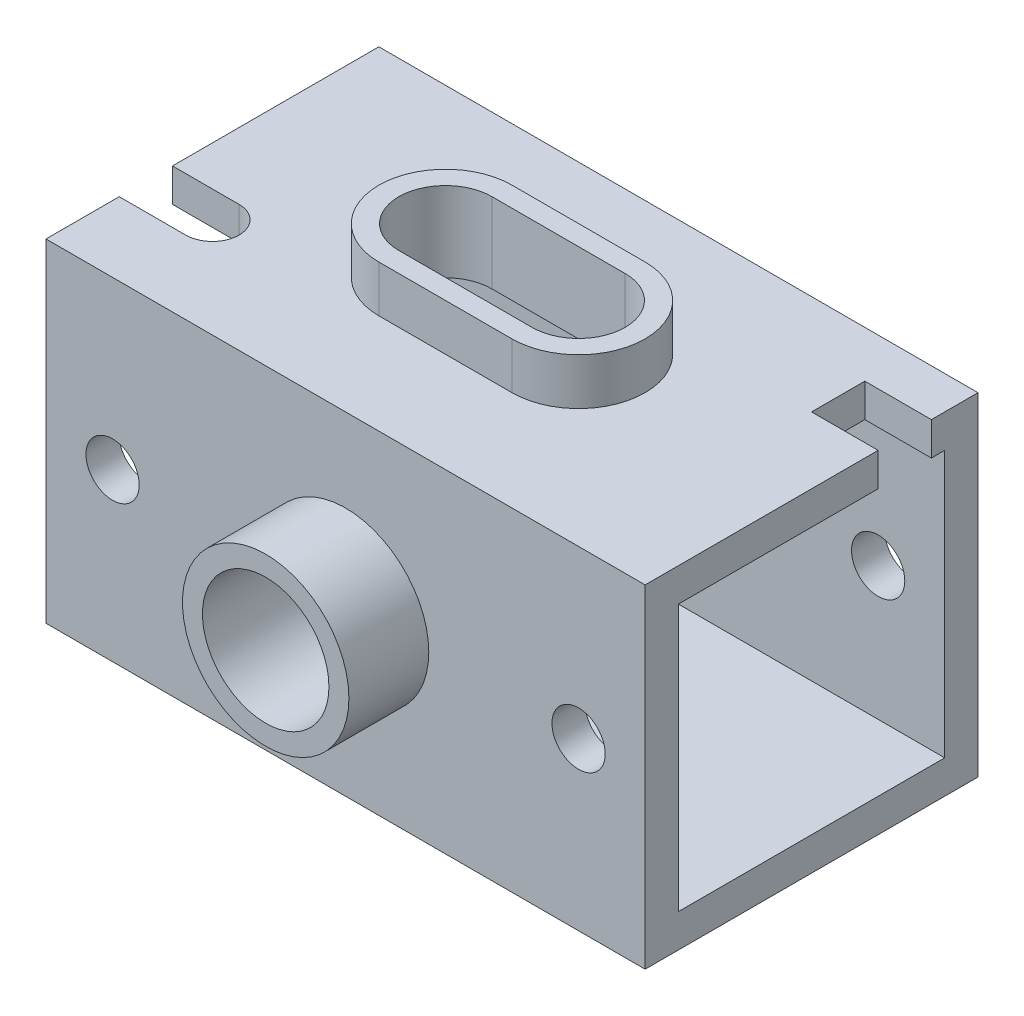
ISO-10303-21;
HEADER;
FILE_DESCRIPTION(('STEP AP214'),'2;1');
FILE_NAME('part.step','',(''),(''),'','','');
FILE_SCHEMA(('AUTOMOTIVE_DESIGN { 1 0 10303 214 1 1 1 1 }'));
ENDSEC;
DATA;
#1=APPLICATION_CONTEXT('core data for automotive mechanical design processes');
#2=APPLICATION_PROTOCOL_DEFINITION('international standard','automotive_design',2000,#1);
#3=PRODUCT_CONTEXT('',#1,'mechanical');
#4=PRODUCT('Part','Part','',(#3));
#5=PRODUCT_RELATED_PRODUCT_CATEGORY('part','',(#4));
#6=PRODUCT_DEFINITION_FORMATION('','',#4);
#7=PRODUCT_DEFINITION_CONTEXT('part definition',#1,'design');
#8=PRODUCT_DEFINITION('design','',#6,#7);
#9=PRODUCT_DEFINITION_SHAPE('','',#8);
#10=(LENGTH_UNIT() NAMED_UNIT(*) SI_UNIT(.MILLI.,.METRE.));
#11=(NAMED_UNIT(*) PLANE_ANGLE_UNIT() SI_UNIT($,.RADIAN.));
#12=(NAMED_UNIT(*) SI_UNIT($,.STERADIAN.) SOLID_ANGLE_UNIT());
#13=UNCERTAINTY_MEASURE_WITH_UNIT(LENGTH_MEASURE(1.E-05),#10,'distance_accuracy_value','');
#14=(GEOMETRIC_REPRESENTATION_CONTEXT(3) GLOBAL_UNCERTAINTY_ASSIGNED_CONTEXT((#13)) GLOBAL_UNIT_ASSIGNED_CONTEXT((#10,
#11,#12)) REPRESENTATION_CONTEXT('',''));
#15=CARTESIAN_POINT('',(0.,0.,0.));
#16=DIRECTION('',(0.,0.,1.));
#17=DIRECTION('',(1.,0.,0.));
#18=AXIS2_PLACEMENT_3D('',#15,#16,#17);
#19=CARTESIAN_POINT('',(0.,0.,-37.));
#20=DIRECTION('',(0.,0.,1.));
#21=DIRECTION('',(1.,0.,0.));
#22=AXIS2_PLACEMENT_3D('',#19,#20,#21);
#23=CYLINDRICAL_SURFACE('',#22,9.5);
#24=CARTESIAN_POINT('',(0.,0.,-37.));
#25=DIRECTION('',(0.,0.,1.));
#26=DIRECTION('',(1.,0.,0.));
#27=AXIS2_PLACEMENT_3D('',#24,#25,#26);
#28=CIRCLE('',#27,9.5);
#29=CARTESIAN_POINT('',(9.50000000000001,0.,-37.));
#30=VERTEX_POINT('',#29);
#31=EDGE_CURVE('E54',#30,#30,#28,.T.);
#32=ORIENTED_EDGE('',*,*,#31,.F.);
#33=EDGE_LOOP('',(#32));
#34=FACE_BOUND('',#33,.T.);
#35=CARTESIAN_POINT('',(0.,0.,-25.));
#36=DIRECTION('',(0.,0.,1.));
#37=DIRECTION('',(1.,0.,0.));
#38=AXIS2_PLACEMENT_3D('',#35,#36,#37);
#39=CIRCLE('',#38,9.5);
#40=CARTESIAN_POINT('',(9.50000000000001,0.,-25.));
#41=VERTEX_POINT('',#40);
#42=EDGE_CURVE('E62',#41,#41,#39,.T.);
#43=ORIENTED_EDGE('',*,*,#42,.T.);
#44=EDGE_LOOP('',(#43));
#45=FACE_BOUND('',#44,.T.);
#46=ADVANCED_FACE('F48',(#34,#45),#23,.F.);
#47=CARTESIAN_POINT('',(0.,0.,-37.));
#48=DIRECTION('',(0.,0.,1.));
#49=DIRECTION('',(1.,0.,0.));
#50=AXIS2_PLACEMENT_3D('',#47,#48,#49);
#51=CYLINDRICAL_SURFACE('',#50,12.5);
#52=CARTESIAN_POINT('',(0.,0.,-37.));
#53=DIRECTION('',(0.,0.,1.));
#54=DIRECTION('',(1.,0.,0.));
#55=AXIS2_PLACEMENT_3D('',#52,#53,#54);
#56=CIRCLE('',#55,12.5);
#57=CARTESIAN_POINT('',(12.5,0.,-37.));
#58=VERTEX_POINT('',#57);
#59=EDGE_CURVE('E11',#58,#58,#56,.T.);
#60=ORIENTED_EDGE('',*,*,#59,.T.);
#61=EDGE_LOOP('',(#60));
#62=FACE_BOUND('',#61,.T.);
#63=CARTESIAN_POINT('',(0.,0.,-25.));
#64=DIRECTION('',(0.,0.,1.));
#65=DIRECTION('',(1.,0.,0.));
#66=AXIS2_PLACEMENT_3D('',#63,#64,#65);
#67=CIRCLE('',#66,12.5);
#68=CARTESIAN_POINT('',(12.5,0.,-25.));
#69=VERTEX_POINT('',#68);
#70=EDGE_CURVE('E51',#69,#69,#67,.T.);
#71=ORIENTED_EDGE('',*,*,#70,.F.);
#72=EDGE_LOOP('',(#71));
#73=FACE_BOUND('',#72,.T.);
#74=ADVANCED_FACE('F68',(#62,#73),#51,.T.);
#75=CARTESIAN_POINT('',(0.,0.,-37.));
#76=DIRECTION('',(0.,0.,1.));
#77=DIRECTION('',(1.,0.,0.));
#78=AXIS2_PLACEMENT_3D('',#75,#76,#77);
#79=PLANE('',#78);
#80=ORIENTED_EDGE('',*,*,#31,.T.);
#81=EDGE_LOOP('',(#80));
#82=FACE_BOUND('',#81,.T.);
#83=ORIENTED_EDGE('',*,*,#59,.F.);
#84=EDGE_LOOP('',(#83));
#85=FACE_BOUND('',#84,.T.);
#86=ADVANCED_FACE('F75',(#82,#85),#79,.F.);
#87=CARTESIAN_POINT('',(0.,0.,-25.));
#88=DIRECTION('',(0.,0.,1.));
#89=DIRECTION('',(1.,0.,0.));
#90=AXIS2_PLACEMENT_3D('',#87,#88,#89);
#91=PLANE('',#90);
#92=ORIENTED_EDGE('',*,*,#42,.F.);
#93=EDGE_LOOP('',(#92));
#94=FACE_BOUND('',#93,.T.);
#95=ORIENTED_EDGE('',*,*,#70,.T.);
#96=EDGE_LOOP('',(#95));
#97=FACE_BOUND('',#96,.T.);
#98=ADVANCED_FACE('F70',(#94,#97),#91,.T.);
#99=CLOSED_SHELL('',(#46,#74,#86,#98));
#100=MANIFOLD_SOLID_BREP('B2',#99);
#101=CARTESIAN_POINT('',(0.,0.,20.));
#102=DIRECTION('',(0.,0.,1.));
#103=DIRECTION('',(1.,0.,0.));
#104=AXIS2_PLACEMENT_3D('',#101,#102,#103);
#105=CYLINDRICAL_SURFACE('',#104,9.5);
#106=CARTESIAN_POINT('',(0.,0.,20.));
#107=DIRECTION('',(0.,0.,1.));
#108=DIRECTION('',(1.,0.,0.));
#109=AXIS2_PLACEMENT_3D('',#106,#107,#108);
#110=CIRCLE('',#109,9.5);
#111=CARTESIAN_POINT('',(9.50000000000001,0.,20.));
#112=VERTEX_POINT('',#111);
#113=EDGE_CURVE('E123',#112,#112,#110,.T.);
#114=ORIENTED_EDGE('',*,*,#113,.F.);
#115=EDGE_LOOP('',(#114));
#116=FACE_BOUND('',#115,.T.);
#117=CARTESIAN_POINT('',(0.,0.,37.));
#118=DIRECTION('',(0.,0.,1.));
#119=DIRECTION('',(1.,0.,0.));
#120=AXIS2_PLACEMENT_3D('',#117,#118,#119);
#121=CIRCLE('',#120,9.5);
#122=CARTESIAN_POINT('',(9.50000000000001,0.,37.));
#123=VERTEX_POINT('',#122);
#124=EDGE_CURVE('E133',#123,#123,#121,.T.);
#125=ORIENTED_EDGE('',*,*,#124,.T.);
#126=EDGE_LOOP('',(#125));
#127=FACE_BOUND('',#126,.T.);
#128=ADVANCED_FACE('F119',(#116,#127),#105,.F.);
#129=CARTESIAN_POINT('',(0.,0.,20.));
#130=DIRECTION('',(0.,0.,1.));
#131=DIRECTION('',(1.,0.,0.));
#132=AXIS2_PLACEMENT_3D('',#129,#130,#131);
#133=CYLINDRICAL_SURFACE('',#132,12.5);
#134=CARTESIAN_POINT('',(0.,0.,20.));
#135=DIRECTION('',(0.,0.,1.));
#136=DIRECTION('',(1.,0.,0.));
#137=AXIS2_PLACEMENT_3D('',#134,#135,#136);
#138=CIRCLE('',#137,12.5);
#139=CARTESIAN_POINT('',(12.5,0.,20.));
#140=VERTEX_POINT('',#139);
#141=EDGE_CURVE('E50',#140,#140,#138,.T.);
#142=ORIENTED_EDGE('',*,*,#141,.T.);
#143=EDGE_LOOP('',(#142));
#144=FACE_BOUND('',#143,.T.);
#145=CARTESIAN_POINT('',(0.,0.,37.));
#146=DIRECTION('',(0.,0.,1.));
#147=DIRECTION('',(1.,0.,0.));
#148=AXIS2_PLACEMENT_3D('',#145,#146,#147);
#149=CIRCLE('',#148,12.5);
#150=CARTESIAN_POINT('',(12.5,0.,37.));
#151=VERTEX_POINT('',#150);
#152=EDGE_CURVE('E129',#151,#151,#149,.T.);
#153=ORIENTED_EDGE('',*,*,#152,.F.);
#154=EDGE_LOOP('',(#153));
#155=FACE_BOUND('',#154,.T.);
#156=ADVANCED_FACE('F150',(#144,#155),#133,.T.);
#157=CARTESIAN_POINT('',(0.,0.,20.));
#158=DIRECTION('',(0.,0.,1.));
#159=DIRECTION('',(1.,0.,0.));
#160=AXIS2_PLACEMENT_3D('',#157,#158,#159);
#161=PLANE('',#160);
#162=ORIENTED_EDGE('',*,*,#113,.T.);
#163=EDGE_LOOP('',(#162));
#164=FACE_BOUND('',#163,.T.);
#165=ORIENTED_EDGE('',*,*,#141,.F.);
#166=EDGE_LOOP('',(#165));
#167=FACE_BOUND('',#166,.T.);
#168=ADVANCED_FACE('F141',(#164,#167),#161,.F.);
#169=CARTESIAN_POINT('',(0.,0.,37.));
#170=DIRECTION('',(0.,0.,1.));
#171=DIRECTION('',(1.,0.,0.));
#172=AXIS2_PLACEMENT_3D('',#169,#170,#171);
#173=PLANE('',#172);
#174=ORIENTED_EDGE('',*,*,#124,.F.);
#175=EDGE_LOOP('',(#174));
#176=FACE_BOUND('',#175,.T.);
#177=ORIENTED_EDGE('',*,*,#152,.T.);
#178=EDGE_LOOP('',(#177));
#179=FACE_BOUND('',#178,.T.);
#180=ADVANCED_FACE('F138',(#176,#179),#173,.T.);
#181=CLOSED_SHELL('',(#128,#156,#168,#180));
#182=MANIFOLD_SOLID_BREP('B6',#181);
#183=CARTESIAN_POINT('',(45.,0.,25.));
#184=DIRECTION('',(-1.,0.,0.));
#185=DIRECTION('',(0.,0.,1.));
#186=AXIS2_PLACEMENT_3D('',#183,#184,#185);
#187=PLANE('',#186);
#188=DIRECTION('',(0.,1.,0.));
#189=VECTOR('',#188,1.);
#190=CARTESIAN_POINT('',(45.,-25.001,-18.));
#191=LINE('',#190,#189);
#192=CARTESIAN_POINT('',(45.,20.,-18.));
#193=VERTEX_POINT('',#192);
#194=CARTESIAN_POINT('',(45.,25.,-18.));
#195=VERTEX_POINT('',#194);
#196=EDGE_CURVE('E441',#193,#195,#191,.T.);
#197=ORIENTED_EDGE('',*,*,#196,.F.);
#198=DIRECTION('',(0.,0.,-1.));
#199=VECTOR('',#198,1.);
#200=CARTESIAN_POINT('',(45.,20.,25.));
#201=LINE('',#200,#199);
#202=CARTESIAN_POINT('',(45.,20.,-20.));
#203=VERTEX_POINT('',#202);
#204=EDGE_CURVE('E511',#193,#203,#201,.T.);
#205=ORIENTED_EDGE('',*,*,#204,.T.);
#206=DIRECTION('',(0.,1.,0.));
#207=VECTOR('',#206,1.);
#208=CARTESIAN_POINT('',(45.,0.,-20.));
#209=LINE('',#208,#207);
#210=CARTESIAN_POINT('',(45.,-20.,-20.));
#211=VERTEX_POINT('',#210);
#212=EDGE_CURVE('E411',#211,#203,#209,.T.);
#213=ORIENTED_EDGE('',*,*,#212,.F.);
#214=DIRECTION('',(0.,0.,-1.));
#215=VECTOR('',#214,1.);
#216=CARTESIAN_POINT('',(45.,-20.,25.));
#217=LINE('',#216,#215);
#218=CARTESIAN_POINT('',(45.,-20.,20.));
#219=VERTEX_POINT('',#218);
#220=EDGE_CURVE('E549',#219,#211,#217,.T.);
#221=ORIENTED_EDGE('',*,*,#220,.F.);
#222=DIRECTION('',(0.,1.,0.));
#223=VECTOR('',#222,1.);
#224=CARTESIAN_POINT('',(45.,0.,20.));
#225=LINE('',#224,#223);
#226=CARTESIAN_POINT('',(45.,20.,20.));
#227=VERTEX_POINT('',#226);
#228=EDGE_CURVE('E484',#219,#227,#225,.T.);
#229=ORIENTED_EDGE('',*,*,#228,.T.);
#230=CARTESIAN_POINT('',(45.,20.,-10.));
#231=VERTEX_POINT('',#230);
#232=EDGE_CURVE('E514',#227,#231,#201,.T.);
#233=ORIENTED_EDGE('',*,*,#232,.T.);
#234=DIRECTION('',(0.,1.,0.));
#235=VECTOR('',#234,1.);
#236=CARTESIAN_POINT('',(45.,-25.001,-10.));
#237=LINE('',#236,#235);
#238=CARTESIAN_POINT('',(45.,25.,-10.));
#239=VERTEX_POINT('',#238);
#240=EDGE_CURVE('E434',#231,#239,#237,.T.);
#241=ORIENTED_EDGE('',*,*,#240,.T.);
#242=DIRECTION('',(0.,0.,-1.));
#243=VECTOR('',#242,1.);
#244=CARTESIAN_POINT('',(45.,25.,25.));
#245=LINE('',#244,#243);
#246=CARTESIAN_POINT('',(45.,25.,25.));
#247=VERTEX_POINT('',#246);
#248=EDGE_CURVE('E508',#247,#239,#245,.T.);
#249=ORIENTED_EDGE('',*,*,#248,.F.);
#250=DIRECTION('',(0.,1.,0.));
#251=VECTOR('',#250,1.);
#252=CARTESIAN_POINT('',(45.,0.,25.));
#253=LINE('',#252,#251);
#254=CARTESIAN_POINT('',(45.,-25.,25.));
#255=VERTEX_POINT('',#254);
#256=EDGE_CURVE('E547',#255,#247,#253,.T.);
#257=ORIENTED_EDGE('',*,*,#256,.F.);
#258=DIRECTION('',(0.,0.,-1.));
#259=VECTOR('',#258,1.);
#260=CARTESIAN_POINT('',(45.,-25.,25.));
#261=LINE('',#260,#259);
#262=CARTESIAN_POINT('',(45.,-25.,-25.));
#263=VERTEX_POINT('',#262);
#264=EDGE_CURVE('E559',#255,#263,#261,.T.);
#265=ORIENTED_EDGE('',*,*,#264,.T.);
#266=DIRECTION('',(0.,1.,0.));
#267=VECTOR('',#266,1.);
#268=CARTESIAN_POINT('',(45.,0.,-25.));
#269=LINE('',#268,#267);
#270=CARTESIAN_POINT('',(45.,25.,-25.));
#271=VERTEX_POINT('',#270);
#272=EDGE_CURVE('E546',#263,#271,#269,.T.);
#273=ORIENTED_EDGE('',*,*,#272,.T.);
#274=EDGE_CURVE('E506',#195,#271,#245,.T.);
#275=ORIENTED_EDGE('',*,*,#274,.F.);
#276=EDGE_LOOP('',(#197,#205,#213,#221,#229,#233,#241,#249,#257,#265,#273,#275));
#277=FACE_BOUND('',#276,.T.);
#278=ADVANCED_FACE('F182',(#277),#187,.F.);
#279=CARTESIAN_POINT('',(0.,20.,25.));
#280=DIRECTION('',(0.,1.,0.));
#281=DIRECTION('',(0.,0.,1.));
#282=AXIS2_PLACEMENT_3D('',#279,#280,#281);
#283=PLANE('',#282);
#284=DIRECTION('',(-1.,0.,0.));
#285=VECTOR('',#284,1.);
#286=CARTESIAN_POINT('',(0.,20.,-7.));
#287=LINE('',#286,#285);
#288=CARTESIAN_POINT('',(10.,20.,-7.));
#289=VERTEX_POINT('',#288);
#290=CARTESIAN_POINT('',(-10.,20.,-7.));
#291=VERTEX_POINT('',#290);
#292=EDGE_CURVE('E353',#289,#291,#287,.T.);
#293=ORIENTED_EDGE('',*,*,#292,.T.);
#294=CARTESIAN_POINT('',(-10.,20.,0.));
#295=DIRECTION('',(0.,1.,0.));
#296=DIRECTION('',(0.,0.,1.));
#297=AXIS2_PLACEMENT_3D('',#294,#295,#296);
#298=CIRCLE('',#297,7.);
#299=CARTESIAN_POINT('',(-10.,20.,7.));
#300=VERTEX_POINT('',#299);
#301=EDGE_CURVE('E346',#300,#291,#298,.F.);
#302=ORIENTED_EDGE('',*,*,#301,.F.);
#303=DIRECTION('',(-1.,0.,0.));
#304=VECTOR('',#303,1.);
#305=CARTESIAN_POINT('',(0.,20.,7.));
#306=LINE('',#305,#304);
#307=CARTESIAN_POINT('',(10.,20.,7.));
#308=VERTEX_POINT('',#307);
#309=EDGE_CURVE('E455',#308,#300,#306,.T.);
#310=ORIENTED_EDGE('',*,*,#309,.F.);
#311=CARTESIAN_POINT('',(10.,20.,0.));
#312=DIRECTION('',(0.,1.,0.));
#313=DIRECTION('',(0.,0.,1.));
#314=AXIS2_PLACEMENT_3D('',#311,#312,#313);
#315=CIRCLE('',#314,7.);
#316=EDGE_CURVE('E453',#289,#308,#315,.F.);
#317=ORIENTED_EDGE('',*,*,#316,.F.);
#318=EDGE_LOOP('',(#293,#302,#310,#317));
#319=FACE_BOUND('',#318,.T.);
#320=DIRECTION('',(-1.,0.,0.));
#321=VECTOR('',#320,1.);
#322=CARTESIAN_POINT('',(0.,20.,14.));
#323=LINE('',#322,#321);
#324=CARTESIAN_POINT('',(-35.,20.,14.));
#325=VERTEX_POINT('',#324);
#326=CARTESIAN_POINT('',(-45.,20.,14.));
#327=VERTEX_POINT('',#326);
#328=EDGE_CURVE('E405',#325,#327,#323,.T.);
#329=ORIENTED_EDGE('',*,*,#328,.F.);
#330=CARTESIAN_POINT('',(-35.,20.,10.));
#331=DIRECTION('',(0.,1.,0.));
#332=DIRECTION('',(0.,0.,1.));
#333=AXIS2_PLACEMENT_3D('',#330,#331,#332);
#334=CIRCLE('',#333,4.);
#335=CARTESIAN_POINT('',(-35.,20.,6.));
#336=VERTEX_POINT('',#335);
#337=EDGE_CURVE('E396',#336,#325,#334,.F.);
#338=ORIENTED_EDGE('',*,*,#337,.F.);
#339=DIRECTION('',(-1.,0.,0.));
#340=VECTOR('',#339,1.);
#341=CARTESIAN_POINT('',(0.,20.,6.));
#342=LINE('',#341,#340);
#343=CARTESIAN_POINT('',(-45.,20.,6.));
#344=VERTEX_POINT('',#343);
#345=EDGE_CURVE('E413',#336,#344,#342,.T.);
#346=ORIENTED_EDGE('',*,*,#345,.T.);
#347=DIRECTION('',(0.,0.,-1.));
#348=VECTOR('',#347,1.);
#349=CARTESIAN_POINT('',(-45.,20.,25.));
#350=LINE('',#349,#348);
#351=CARTESIAN_POINT('',(-45.,20.,-20.));
#352=VERTEX_POINT('',#351);
#353=EDGE_CURVE('E496',#344,#352,#350,.T.);
#354=ORIENTED_EDGE('',*,*,#353,.T.);
#355=DIRECTION('',(1.,0.,0.));
#356=VECTOR('',#355,1.);
#357=CARTESIAN_POINT('',(0.,20.,-20.));
#358=LINE('',#357,#356);
#359=EDGE_CURVE('E477',#352,#203,#358,.T.);
#360=ORIENTED_EDGE('',*,*,#359,.T.);
#361=ORIENTED_EDGE('',*,*,#204,.F.);
#362=DIRECTION('',(1.,0.,0.));
#363=VECTOR('',#362,1.);
#364=CARTESIAN_POINT('',(0.,20.,-18.));
#365=LINE('',#364,#363);
#366=CARTESIAN_POINT('',(35.,20.,-18.));
#367=VERTEX_POINT('',#366);
#368=EDGE_CURVE('E426',#367,#193,#365,.T.);
#369=ORIENTED_EDGE('',*,*,#368,.F.);
#370=DIRECTION('',(0.,0.,-1.));
#371=VECTOR('',#370,1.);
#372=CARTESIAN_POINT('',(35.,20.,0.));
#373=LINE('',#372,#371);
#374=CARTESIAN_POINT('',(35.,20.,-9.99999999999999));
#375=VERTEX_POINT('',#374);
#376=EDGE_CURVE('E430',#375,#367,#373,.T.);
#377=ORIENTED_EDGE('',*,*,#376,.F.);
#378=DIRECTION('',(1.,0.,0.));
#379=VECTOR('',#378,1.);
#380=CARTESIAN_POINT('',(0.,20.,-9.99999999999998));
#381=LINE('',#380,#379);
#382=EDGE_CURVE('E442',#375,#231,#381,.T.);
#383=ORIENTED_EDGE('',*,*,#382,.T.);
#384=ORIENTED_EDGE('',*,*,#232,.F.);
#385=DIRECTION('',(1.,0.,0.));
#386=VECTOR('',#385,1.);
#387=CARTESIAN_POINT('',(0.,20.,20.));
#388=LINE('',#387,#386);
#389=CARTESIAN_POINT('',(-45.,20.,20.));
#390=VERTEX_POINT('',#389);
#391=EDGE_CURVE('E533',#390,#227,#388,.T.);
#392=ORIENTED_EDGE('',*,*,#391,.F.);
#393=EDGE_CURVE('E505',#390,#327,#350,.T.);
#394=ORIENTED_EDGE('',*,*,#393,.T.);
#395=EDGE_LOOP('',(#329,#338,#346,#354,#360,#361,#369,#377,#383,#384,#392,#394));
#396=FACE_BOUND('',#395,.T.);
#397=ADVANCED_FACE('F605',(#319,#396),#283,.F.);
#398=CARTESIAN_POINT('',(0.,25.,25.));
#399=DIRECTION('',(0.,1.,0.));
#400=DIRECTION('',(0.,0.,1.));
#401=AXIS2_PLACEMENT_3D('',#398,#399,#400);
#402=PLANE('',#401);
#403=DIRECTION('',(1.,0.,0.));
#404=VECTOR('',#403,1.);
#405=CARTESIAN_POINT('',(0.,25.,10.));
#406=LINE('',#405,#404);
#407=CARTESIAN_POINT('',(-10.,25.,10.));
#408=VERTEX_POINT('',#407);
#409=CARTESIAN_POINT('',(10.,25.,10.));
#410=VERTEX_POINT('',#409);
#411=EDGE_CURVE('E198',#408,#410,#406,.T.);
#412=ORIENTED_EDGE('',*,*,#411,.F.);
#413=CARTESIAN_POINT('',(-10.,25.,0.));
#414=DIRECTION('',(0.,1.,0.));
#415=DIRECTION('',(0.,0.,1.));
#416=AXIS2_PLACEMENT_3D('',#413,#414,#415);
#417=CIRCLE('',#416,10.);
#418=CARTESIAN_POINT('',(-10.,25.,-10.));
#419=VERTEX_POINT('',#418);
#420=EDGE_CURVE('E199',#419,#408,#417,.T.);
#421=ORIENTED_EDGE('',*,*,#420,.F.);
#422=DIRECTION('',(1.,0.,0.));
#423=VECTOR('',#422,1.);
#424=CARTESIAN_POINT('',(0.,25.,-10.));
#425=LINE('',#424,#423);
#426=CARTESIAN_POINT('',(10.,25.,-10.));
#427=VERTEX_POINT('',#426);
#428=EDGE_CURVE('E366',#419,#427,#425,.T.);
#429=ORIENTED_EDGE('',*,*,#428,.T.);
#430=CARTESIAN_POINT('',(10.,25.,0.));
#431=DIRECTION('',(0.,1.,0.));
#432=DIRECTION('',(0.,0.,1.));
#433=AXIS2_PLACEMENT_3D('',#430,#431,#432);
#434=CIRCLE('',#433,10.);
#435=EDGE_CURVE('E384',#410,#427,#434,.T.);
#436=ORIENTED_EDGE('',*,*,#435,.F.);
#437=EDGE_LOOP('',(#412,#421,#429,#436));
#438=FACE_BOUND('',#437,.T.);
#439=DIRECTION('',(1.,0.,0.));
#440=VECTOR('',#439,1.);
#441=CARTESIAN_POINT('',(0.,25.,14.));
#442=LINE('',#441,#440);
#443=CARTESIAN_POINT('',(-45.,25.,14.));
#444=VERTEX_POINT('',#443);
#445=CARTESIAN_POINT('',(-35.,25.,14.));
#446=VERTEX_POINT('',#445);
#447=EDGE_CURVE('E412',#444,#446,#442,.T.);
#448=ORIENTED_EDGE('',*,*,#447,.F.);
#449=DIRECTION('',(0.,0.,-1.));
#450=VECTOR('',#449,1.);
#451=CARTESIAN_POINT('',(-45.,25.,25.));
#452=LINE('',#451,#450);
#453=CARTESIAN_POINT('',(-45.,25.,25.));
#454=VERTEX_POINT('',#453);
#455=EDGE_CURVE('E507',#454,#444,#452,.T.);
#456=ORIENTED_EDGE('',*,*,#455,.F.);
#457=DIRECTION('',(1.,0.,0.));
#458=VECTOR('',#457,1.);
#459=CARTESIAN_POINT('',(0.,25.,25.));
#460=LINE('',#459,#458);
#461=EDGE_CURVE('E497',#454,#247,#460,.T.);
#462=ORIENTED_EDGE('',*,*,#461,.T.);
#463=ORIENTED_EDGE('',*,*,#248,.T.);
#464=DIRECTION('',(-1.,0.,0.));
#465=VECTOR('',#464,1.);
#466=CARTESIAN_POINT('',(0.,25.,-9.99999999999998));
#467=LINE('',#466,#465);
#468=CARTESIAN_POINT('',(35.,25.,-9.99999999999999));
#469=VERTEX_POINT('',#468);
#470=EDGE_CURVE('E431',#239,#469,#467,.T.);
#471=ORIENTED_EDGE('',*,*,#470,.T.);
#472=DIRECTION('',(0.,0.,1.));
#473=VECTOR('',#472,1.);
#474=CARTESIAN_POINT('',(35.,25.,0.));
#475=LINE('',#474,#473);
#476=CARTESIAN_POINT('',(35.,25.,-18.));
#477=VERTEX_POINT('',#476);
#478=EDGE_CURVE('E429',#477,#469,#475,.T.);
#479=ORIENTED_EDGE('',*,*,#478,.F.);
#480=DIRECTION('',(-1.,0.,0.));
#481=VECTOR('',#480,1.);
#482=CARTESIAN_POINT('',(0.,25.,-18.));
#483=LINE('',#482,#481);
#484=EDGE_CURVE('E437',#195,#477,#483,.T.);
#485=ORIENTED_EDGE('',*,*,#484,.F.);
#486=ORIENTED_EDGE('',*,*,#274,.T.);
#487=DIRECTION('',(1.,0.,0.));
#488=VECTOR('',#487,1.);
#489=CARTESIAN_POINT('',(0.,25.,-25.));
#490=LINE('',#489,#488);
#491=CARTESIAN_POINT('',(-45.,25.,-25.));
#492=VERTEX_POINT('',#491);
#493=EDGE_CURVE('E494',#492,#271,#490,.T.);
#494=ORIENTED_EDGE('',*,*,#493,.F.);
#495=CARTESIAN_POINT('',(-45.,25.,6.));
#496=VERTEX_POINT('',#495);
#497=EDGE_CURVE('E501',#496,#492,#452,.T.);
#498=ORIENTED_EDGE('',*,*,#497,.F.);
#499=DIRECTION('',(1.,0.,0.));
#500=VECTOR('',#499,1.);
#501=CARTESIAN_POINT('',(0.,25.,6.));
#502=LINE('',#501,#500);
#503=CARTESIAN_POINT('',(-35.,25.,6.));
#504=VERTEX_POINT('',#503);
#505=EDGE_CURVE('E404',#496,#504,#502,.T.);
#506=ORIENTED_EDGE('',*,*,#505,.T.);
#507=CARTESIAN_POINT('',(-35.,25.,10.));
#508=DIRECTION('',(0.,1.,0.));
#509=DIRECTION('',(0.,0.,1.));
#510=AXIS2_PLACEMENT_3D('',#507,#508,#509);
#511=CIRCLE('',#510,4.);
#512=EDGE_CURVE('E401',#446,#504,#511,.T.);
#513=ORIENTED_EDGE('',*,*,#512,.F.);
#514=EDGE_LOOP('',(#448,#456,#462,#463,#471,#479,#485,#486,#494,#498,#506,#513));
#515=FACE_BOUND('',#514,.T.);
#516=ADVANCED_FACE('F578',(#438,#515),#402,.T.);
#517=CARTESIAN_POINT('',(0.,-20.,25.));
#518=DIRECTION('',(0.,1.,0.));
#519=DIRECTION('',(0.,0.,1.));
#520=AXIS2_PLACEMENT_3D('',#517,#518,#519);
#521=PLANE('',#520);
#522=DIRECTION('',(1.,0.,0.));
#523=VECTOR('',#522,1.);
#524=CARTESIAN_POINT('',(0.,-20.,-20.));
#525=LINE('',#524,#523);
#526=CARTESIAN_POINT('',(-45.,-20.,-20.));
#527=VERTEX_POINT('',#526);
#528=EDGE_CURVE('E483',#527,#211,#525,.T.);
#529=ORIENTED_EDGE('',*,*,#528,.F.);
#530=DIRECTION('',(0.,0.,-1.));
#531=VECTOR('',#530,1.);
#532=CARTESIAN_POINT('',(-45.,-20.,25.));
#533=LINE('',#532,#531);
#534=CARTESIAN_POINT('',(-45.,-20.,20.));
#535=VERTEX_POINT('',#534);
#536=EDGE_CURVE('E120',#535,#527,#533,.T.);
#537=ORIENTED_EDGE('',*,*,#536,.F.);
#538=DIRECTION('',(1.,0.,0.));
#539=VECTOR('',#538,1.);
#540=CARTESIAN_POINT('',(0.,-20.,20.));
#541=LINE('',#540,#539);
#542=EDGE_CURVE('E531',#535,#219,#541,.T.);
#543=ORIENTED_EDGE('',*,*,#542,.T.);
#544=ORIENTED_EDGE('',*,*,#220,.T.);
#545=EDGE_LOOP('',(#529,#537,#543,#544));
#546=FACE_BOUND('',#545,.T.);
#547=ADVANCED_FACE('F181',(#546),#521,.T.);
#548=CARTESIAN_POINT('',(-45.,0.,25.));
#549=DIRECTION('',(-1.,0.,0.));
#550=DIRECTION('',(0.,0.,1.));
#551=AXIS2_PLACEMENT_3D('',#548,#549,#550);
#552=PLANE('',#551);
#553=DIRECTION('',(0.,1.,0.));
#554=VECTOR('',#553,1.);
#555=CARTESIAN_POINT('',(-45.,-25.001,14.));
#556=LINE('',#555,#554);
#557=EDGE_CURVE('E416',#327,#444,#556,.T.);
#558=ORIENTED_EDGE('',*,*,#557,.F.);
#559=ORIENTED_EDGE('',*,*,#393,.F.);
#560=DIRECTION('',(0.,1.,0.));
#561=VECTOR('',#560,1.);
#562=CARTESIAN_POINT('',(-45.,0.,20.));
#563=LINE('',#562,#561);
#564=EDGE_CURVE('E520',#535,#390,#563,.T.);
#565=ORIENTED_EDGE('',*,*,#564,.F.);
#566=ORIENTED_EDGE('',*,*,#536,.T.);
#567=DIRECTION('',(0.,1.,0.));
#568=VECTOR('',#567,1.);
#569=CARTESIAN_POINT('',(-45.,0.,-20.));
#570=LINE('',#569,#568);
#571=EDGE_CURVE('E464',#527,#352,#570,.T.);
#572=ORIENTED_EDGE('',*,*,#571,.T.);
#573=ORIENTED_EDGE('',*,*,#353,.F.);
#574=DIRECTION('',(0.,1.,0.));
#575=VECTOR('',#574,1.);
#576=CARTESIAN_POINT('',(-45.,-25.001,6.));
#577=LINE('',#576,#575);
#578=EDGE_CURVE('E408',#344,#496,#577,.T.);
#579=ORIENTED_EDGE('',*,*,#578,.T.);
#580=ORIENTED_EDGE('',*,*,#497,.T.);
#581=DIRECTION('',(0.,1.,0.));
#582=VECTOR('',#581,1.);
#583=CARTESIAN_POINT('',(-45.,0.,-25.));
#584=LINE('',#583,#582);
#585=CARTESIAN_POINT('',(-45.,-25.,-25.));
#586=VERTEX_POINT('',#585);
#587=EDGE_CURVE('E532',#586,#492,#584,.T.);
#588=ORIENTED_EDGE('',*,*,#587,.F.);
#589=DIRECTION('',(0.,0.,-1.));
#590=VECTOR('',#589,1.);
#591=CARTESIAN_POINT('',(-45.,-25.,25.));
#592=LINE('',#591,#590);
#593=CARTESIAN_POINT('',(-45.,-25.,25.));
#594=VERTEX_POINT('',#593);
#595=EDGE_CURVE('E189',#594,#586,#592,.T.);
#596=ORIENTED_EDGE('',*,*,#595,.F.);
#597=DIRECTION('',(0.,1.,0.));
#598=VECTOR('',#597,1.);
#599=CARTESIAN_POINT('',(-45.,0.,25.));
#600=LINE('',#599,#598);
#601=EDGE_CURVE('E543',#594,#454,#600,.T.);
#602=ORIENTED_EDGE('',*,*,#601,.T.);
#603=ORIENTED_EDGE('',*,*,#455,.T.);
#604=EDGE_LOOP('',(#558,#559,#565,#566,#572,#573,#579,#580,#588,#596,#602,#603));
#605=FACE_BOUND('',#604,.T.);
#606=ADVANCED_FACE('F571',(#605),#552,.T.);
#607=CARTESIAN_POINT('',(0.,-25.,25.));
#608=DIRECTION('',(0.,1.,0.));
#609=DIRECTION('',(0.,0.,1.));
#610=AXIS2_PLACEMENT_3D('',#607,#608,#609);
#611=PLANE('',#610);
#612=DIRECTION('',(1.,0.,0.));
#613=VECTOR('',#612,1.);
#614=CARTESIAN_POINT('',(0.,-25.,-25.));
#615=LINE('',#614,#613);
#616=EDGE_CURVE('E554',#586,#263,#615,.T.);
#617=ORIENTED_EDGE('',*,*,#616,.T.);
#618=ORIENTED_EDGE('',*,*,#264,.F.);
#619=DIRECTION('',(1.,0.,0.));
#620=VECTOR('',#619,1.);
#621=CARTESIAN_POINT('',(0.,-25.,25.));
#622=LINE('',#621,#620);
#623=EDGE_CURVE('E544',#594,#255,#622,.T.);
#624=ORIENTED_EDGE('',*,*,#623,.F.);
#625=ORIENTED_EDGE('',*,*,#595,.T.);
#626=EDGE_LOOP('',(#617,#618,#624,#625));
#627=FACE_BOUND('',#626,.T.);
#628=ADVANCED_FACE('F561',(#627),#611,.F.);
#629=CARTESIAN_POINT('',(0.,0.,25.));
#630=DIRECTION('',(0.,0.,1.));
#631=DIRECTION('',(1.,0.,0.));
#632=AXIS2_PLACEMENT_3D('',#629,#630,#631);
#633=PLANE('',#632);
#634=ORIENTED_EDGE('',*,*,#256,.T.);
#635=ORIENTED_EDGE('',*,*,#461,.F.);
#636=ORIENTED_EDGE('',*,*,#601,.F.);
#637=ORIENTED_EDGE('',*,*,#623,.T.);
#638=EDGE_LOOP('',(#634,#635,#636,#637));
#639=FACE_BOUND('',#638,.T.);
#640=CARTESIAN_POINT('',(-35.,0.,25.));
#641=DIRECTION('',(0.,0.,1.));
#642=DIRECTION('',(1.,0.,0.));
#643=AXIS2_PLACEMENT_3D('',#640,#641,#642);
#644=CIRCLE('',#643,4.);
#645=CARTESIAN_POINT('',(-31.,0.,25.));
#646=VERTEX_POINT('',#645);
#647=EDGE_CURVE('E516',#646,#646,#644,.T.);
#648=ORIENTED_EDGE('',*,*,#647,.F.);
#649=EDGE_LOOP('',(#648));
#650=FACE_BOUND('',#649,.T.);
#651=CARTESIAN_POINT('',(0.,0.,25.));
#652=DIRECTION('',(0.,0.,1.));
#653=DIRECTION('',(1.,0.,0.));
#654=AXIS2_PLACEMENT_3D('',#651,#652,#653);
#655=CIRCLE('',#654,12.5);
#656=CARTESIAN_POINT('',(12.5,0.,25.));
#657=VERTEX_POINT('',#656);
#658=EDGE_CURVE('E538',#657,#657,#655,.T.);
#659=ORIENTED_EDGE('',*,*,#658,.F.);
#660=EDGE_LOOP('',(#659));
#661=FACE_BOUND('',#660,.T.);
#662=CARTESIAN_POINT('',(35.,0.,25.));
#663=DIRECTION('',(0.,0.,1.));
#664=DIRECTION('',(1.,0.,0.));
#665=AXIS2_PLACEMENT_3D('',#662,#663,#664);
#666=CIRCLE('',#665,4.00000000000001);
#667=CARTESIAN_POINT('',(39.,0.,25.));
#668=VERTEX_POINT('',#667);
#669=EDGE_CURVE('E523',#668,#668,#666,.T.);
#670=ORIENTED_EDGE('',*,*,#669,.F.);
#671=EDGE_LOOP('',(#670));
#672=FACE_BOUND('',#671,.T.);
#673=ADVANCED_FACE('F591',(#639,#650,#661,#672),#633,.T.);
#674=CARTESIAN_POINT('',(0.,0.,-25.));
#675=DIRECTION('',(0.,0.,1.));
#676=DIRECTION('',(1.,0.,0.));
#677=AXIS2_PLACEMENT_3D('',#674,#675,#676);
#678=PLANE('',#677);
#679=ORIENTED_EDGE('',*,*,#493,.T.);
#680=ORIENTED_EDGE('',*,*,#272,.F.);
#681=ORIENTED_EDGE('',*,*,#616,.F.);
#682=ORIENTED_EDGE('',*,*,#587,.T.);
#683=EDGE_LOOP('',(#679,#680,#681,#682));
#684=FACE_BOUND('',#683,.T.);
#685=CARTESIAN_POINT('',(-35.,0.,-25.));
#686=DIRECTION('',(0.,0.,1.));
#687=DIRECTION('',(1.,0.,0.));
#688=AXIS2_PLACEMENT_3D('',#685,#686,#687);
#689=CIRCLE('',#688,4.);
#690=CARTESIAN_POINT('',(-31.,0.,-25.));
#691=VERTEX_POINT('',#690);
#692=EDGE_CURVE('E469',#691,#691,#689,.T.);
#693=ORIENTED_EDGE('',*,*,#692,.T.);
#694=EDGE_LOOP('',(#693));
#695=FACE_BOUND('',#694,.T.);
#696=CARTESIAN_POINT('',(0.,0.,-25.));
#697=DIRECTION('',(0.,0.,1.));
#698=DIRECTION('',(1.,0.,0.));
#699=AXIS2_PLACEMENT_3D('',#696,#697,#698);
#700=CIRCLE('',#699,12.5);
#701=CARTESIAN_POINT('',(12.5,0.,-25.));
#702=VERTEX_POINT('',#701);
#703=EDGE_CURVE('E488',#702,#702,#700,.T.);
#704=ORIENTED_EDGE('',*,*,#703,.T.);
#705=EDGE_LOOP('',(#704));
#706=FACE_BOUND('',#705,.T.);
#707=CARTESIAN_POINT('',(35.,0.,-25.));
#708=DIRECTION('',(0.,0.,1.));
#709=DIRECTION('',(1.,0.,0.));
#710=AXIS2_PLACEMENT_3D('',#707,#708,#709);
#711=CIRCLE('',#710,4.00000000000001);
#712=CARTESIAN_POINT('',(39.,0.,-25.));
#713=VERTEX_POINT('',#712);
#714=EDGE_CURVE('E475',#713,#713,#711,.T.);
#715=ORIENTED_EDGE('',*,*,#714,.T.);
#716=EDGE_LOOP('',(#715));
#717=FACE_BOUND('',#716,.T.);
#718=ADVANCED_FACE('F572',(#684,#695,#706,#717),#678,.F.);
#719=CARTESIAN_POINT('',(35.,0.,20.));
#720=DIRECTION('',(0.,0.,1.));
#721=DIRECTION('',(1.,0.,0.));
#722=AXIS2_PLACEMENT_3D('',#719,#720,#721);
#723=CYLINDRICAL_SURFACE('',#722,4.00000000000001);
#724=CARTESIAN_POINT('',(35.,0.,20.));
#725=DIRECTION('',(0.,0.,1.));
#726=DIRECTION('',(1.,0.,0.));
#727=AXIS2_PLACEMENT_3D('',#724,#725,#726);
#728=CIRCLE('',#727,4.00000000000001);
#729=CARTESIAN_POINT('',(39.,0.,20.));
#730=VERTEX_POINT('',#729);
#731=EDGE_CURVE('E526',#730,#730,#728,.T.);
#732=ORIENTED_EDGE('',*,*,#731,.F.);
#733=EDGE_LOOP('',(#732));
#734=FACE_BOUND('',#733,.T.);
#735=ORIENTED_EDGE('',*,*,#669,.T.);
#736=EDGE_LOOP('',(#735));
#737=FACE_BOUND('',#736,.T.);
#738=ADVANCED_FACE('F663',(#734,#737),#723,.F.);
#739=CARTESIAN_POINT('',(0.,0.,20.));
#740=DIRECTION('',(0.,0.,1.));
#741=DIRECTION('',(1.,0.,0.));
#742=AXIS2_PLACEMENT_3D('',#739,#740,#741);
#743=CYLINDRICAL_SURFACE('',#742,12.5);
#744=CARTESIAN_POINT('',(0.,0.,20.));
#745=DIRECTION('',(0.,0.,1.));
#746=DIRECTION('',(1.,0.,0.));
#747=AXIS2_PLACEMENT_3D('',#744,#745,#746);
#748=CIRCLE('',#747,12.5);
#749=CARTESIAN_POINT('',(12.5,0.,20.));
#750=VERTEX_POINT('',#749);
#751=EDGE_CURVE('E521',#750,#750,#748,.T.);
#752=ORIENTED_EDGE('',*,*,#751,.F.);
#753=EDGE_LOOP('',(#752));
#754=FACE_BOUND('',#753,.T.);
#755=ORIENTED_EDGE('',*,*,#658,.T.);
#756=EDGE_LOOP('',(#755));
#757=FACE_BOUND('',#756,.T.);
#758=ADVANCED_FACE('F668',(#754,#757),#743,.F.);
#759=CARTESIAN_POINT('',(-35.,0.,20.));
#760=DIRECTION('',(0.,0.,1.));
#761=DIRECTION('',(1.,0.,0.));
#762=AXIS2_PLACEMENT_3D('',#759,#760,#761);
#763=CYLINDRICAL_SURFACE('',#762,4.);
#764=CARTESIAN_POINT('',(-35.,0.,20.));
#765=DIRECTION('',(0.,0.,1.));
#766=DIRECTION('',(1.,0.,0.));
#767=AXIS2_PLACEMENT_3D('',#764,#765,#766);
#768=CIRCLE('',#767,4.);
#769=CARTESIAN_POINT('',(-31.,0.,20.));
#770=VERTEX_POINT('',#769);
#771=EDGE_CURVE('E522',#770,#770,#768,.T.);
#772=ORIENTED_EDGE('',*,*,#771,.F.);
#773=EDGE_LOOP('',(#772));
#774=FACE_BOUND('',#773,.T.);
#775=ORIENTED_EDGE('',*,*,#647,.T.);
#776=EDGE_LOOP('',(#775));
#777=FACE_BOUND('',#776,.T.);
#778=ADVANCED_FACE('F664',(#774,#777),#763,.F.);
#779=CARTESIAN_POINT('',(0.,0.,20.));
#780=DIRECTION('',(0.,0.,1.));
#781=DIRECTION('',(1.,0.,0.));
#782=AXIS2_PLACEMENT_3D('',#779,#780,#781);
#783=PLANE('',#782);
#784=ORIENTED_EDGE('',*,*,#771,.T.);
#785=EDGE_LOOP('',(#784));
#786=FACE_BOUND('',#785,.T.);
#787=ORIENTED_EDGE('',*,*,#751,.T.);
#788=EDGE_LOOP('',(#787));
#789=FACE_BOUND('',#788,.T.);
#790=ORIENTED_EDGE('',*,*,#731,.T.);
#791=EDGE_LOOP('',(#790));
#792=FACE_BOUND('',#791,.T.);
#793=ORIENTED_EDGE('',*,*,#391,.T.);
#794=ORIENTED_EDGE('',*,*,#228,.F.);
#795=ORIENTED_EDGE('',*,*,#542,.F.);
#796=ORIENTED_EDGE('',*,*,#564,.T.);
#797=EDGE_LOOP('',(#793,#794,#795,#796));
#798=FACE_BOUND('',#797,.T.);
#799=ADVANCED_FACE('F607',(#786,#789,#792,#798),#783,.F.);
#800=CARTESIAN_POINT('',(35.,0.,-20.));
#801=DIRECTION('',(0.,0.,-1.));
#802=DIRECTION('',(-1.,0.,0.));
#803=AXIS2_PLACEMENT_3D('',#800,#801,#802);
#804=CYLINDRICAL_SURFACE('',#803,4.00000000000001);
#805=CARTESIAN_POINT('',(35.,0.,-20.));
#806=DIRECTION('',(0.,0.,1.));
#807=DIRECTION('',(1.,0.,0.));
#808=AXIS2_PLACEMENT_3D('',#805,#806,#807);
#809=CIRCLE('',#808,4.00000000000001);
#810=CARTESIAN_POINT('',(39.,0.,-20.));
#811=VERTEX_POINT('',#810);
#812=EDGE_CURVE('E480',#811,#811,#809,.T.);
#813=ORIENTED_EDGE('',*,*,#812,.T.);
#814=EDGE_LOOP('',(#813));
#815=FACE_BOUND('',#814,.T.);
#816=ORIENTED_EDGE('',*,*,#714,.F.);
#817=EDGE_LOOP('',(#816));
#818=FACE_BOUND('',#817,.T.);
#819=ADVANCED_FACE('F665',(#815,#818),#804,.F.);
#820=CARTESIAN_POINT('',(0.,0.,-20.));
#821=DIRECTION('',(0.,0.,-1.));
#822=DIRECTION('',(-1.,0.,0.));
#823=AXIS2_PLACEMENT_3D('',#820,#821,#822);
#824=CYLINDRICAL_SURFACE('',#823,12.5);
#825=CARTESIAN_POINT('',(0.,0.,-20.));
#826=DIRECTION('',(0.,0.,1.));
#827=DIRECTION('',(1.,0.,0.));
#828=AXIS2_PLACEMENT_3D('',#825,#826,#827);
#829=CIRCLE('',#828,12.5);
#830=CARTESIAN_POINT('',(12.5,0.,-20.));
#831=VERTEX_POINT('',#830);
#832=EDGE_CURVE('E471',#831,#831,#829,.T.);
#833=ORIENTED_EDGE('',*,*,#832,.T.);
#834=EDGE_LOOP('',(#833));
#835=FACE_BOUND('',#834,.T.);
#836=ORIENTED_EDGE('',*,*,#703,.F.);
#837=EDGE_LOOP('',(#836));
#838=FACE_BOUND('',#837,.T.);
#839=ADVANCED_FACE('F690',(#835,#838),#824,.F.);
#840=CARTESIAN_POINT('',(-35.,0.,-20.));
#841=DIRECTION('',(0.,0.,-1.));
#842=DIRECTION('',(-1.,0.,0.));
#843=AXIS2_PLACEMENT_3D('',#840,#841,#842);
#844=CYLINDRICAL_SURFACE('',#843,4.);
#845=CARTESIAN_POINT('',(-35.,0.,-20.));
#846=DIRECTION('',(0.,0.,1.));
#847=DIRECTION('',(1.,0.,0.));
#848=AXIS2_PLACEMENT_3D('',#845,#846,#847);
#849=CIRCLE('',#848,4.);
#850=CARTESIAN_POINT('',(-31.,0.,-20.));
#851=VERTEX_POINT('',#850);
#852=EDGE_CURVE('E468',#851,#851,#849,.T.);
#853=ORIENTED_EDGE('',*,*,#852,.T.);
#854=EDGE_LOOP('',(#853));
#855=FACE_BOUND('',#854,.T.);
#856=ORIENTED_EDGE('',*,*,#692,.F.);
#857=EDGE_LOOP('',(#856));
#858=FACE_BOUND('',#857,.T.);
#859=ADVANCED_FACE('F657',(#855,#858),#844,.F.);
#860=CARTESIAN_POINT('',(0.,0.,-20.));
#861=DIRECTION('',(0.,0.,-1.));
#862=DIRECTION('',(1.,0.,0.));
#863=AXIS2_PLACEMENT_3D('',#860,#861,#862);
#864=PLANE('',#863);
#865=ORIENTED_EDGE('',*,*,#852,.F.);
#866=EDGE_LOOP('',(#865));
#867=FACE_BOUND('',#866,.T.);
#868=ORIENTED_EDGE('',*,*,#832,.F.);
#869=EDGE_LOOP('',(#868));
#870=FACE_BOUND('',#869,.T.);
#871=ORIENTED_EDGE('',*,*,#812,.F.);
#872=EDGE_LOOP('',(#871));
#873=FACE_BOUND('',#872,.T.);
#874=ORIENTED_EDGE('',*,*,#359,.F.);
#875=ORIENTED_EDGE('',*,*,#571,.F.);
#876=ORIENTED_EDGE('',*,*,#528,.T.);
#877=ORIENTED_EDGE('',*,*,#212,.T.);
#878=EDGE_LOOP('',(#874,#875,#876,#877));
#879=FACE_BOUND('',#878,.T.);
#880=ADVANCED_FACE('F611',(#867,#870,#873,#879),#864,.F.);
#881=CARTESIAN_POINT('',(0.,-25.001,-7.));
#882=DIRECTION('',(0.,0.,1.));
#883=DIRECTION('',(1.,0.,0.));
#884=AXIS2_PLACEMENT_3D('',#881,#882,#883);
#885=PLANE('',#884);
#886=DIRECTION('',(0.,1.,0.));
#887=VECTOR('',#886,1.);
#888=CARTESIAN_POINT('',(10.,-25.001,-7.));
#889=LINE('',#888,#887);
#890=CARTESIAN_POINT('',(10.,32.,-7.));
#891=VERTEX_POINT('',#890);
#892=EDGE_CURVE('E355',#289,#891,#889,.T.);
#893=ORIENTED_EDGE('',*,*,#892,.T.);
#894=DIRECTION('',(1.,0.,0.));
#895=VECTOR('',#894,1.);
#896=CARTESIAN_POINT('',(0.,32.,-7.));
#897=LINE('',#896,#895);
#898=CARTESIAN_POINT('',(-10.,32.,-7.));
#899=VERTEX_POINT('',#898);
#900=EDGE_CURVE('E357',#899,#891,#897,.T.);
#901=ORIENTED_EDGE('',*,*,#900,.F.);
#902=DIRECTION('',(0.,1.,0.));
#903=VECTOR('',#902,1.);
#904=CARTESIAN_POINT('',(-10.,-25.001,-7.));
#905=LINE('',#904,#903);
#906=EDGE_CURVE('E336',#291,#899,#905,.T.);
#907=ORIENTED_EDGE('',*,*,#906,.F.);
#908=ORIENTED_EDGE('',*,*,#292,.F.);
#909=EDGE_LOOP('',(#893,#901,#907,#908));
#910=FACE_BOUND('',#909,.T.);
#911=ADVANCED_FACE('F359',(#910),#885,.T.);
#912=CARTESIAN_POINT('',(10.,-25.001,0.));
#913=DIRECTION('',(0.,1.,0.));
#914=DIRECTION('',(0.,0.,1.));
#915=AXIS2_PLACEMENT_3D('',#912,#913,#914);
#916=CYLINDRICAL_SURFACE('',#915,7.);
#917=ORIENTED_EDGE('',*,*,#316,.T.);
#918=DIRECTION('',(0.,1.,0.));
#919=VECTOR('',#918,1.);
#920=CARTESIAN_POINT('',(10.,-25.001,7.));
#921=LINE('',#920,#919);
#922=CARTESIAN_POINT('',(10.,32.,7.));
#923=VERTEX_POINT('',#922);
#924=EDGE_CURVE('E462',#308,#923,#921,.T.);
#925=ORIENTED_EDGE('',*,*,#924,.T.);
#926=CARTESIAN_POINT('',(10.,32.,0.));
#927=DIRECTION('',(0.,1.,0.));
#928=DIRECTION('',(0.,0.,1.));
#929=AXIS2_PLACEMENT_3D('',#926,#927,#928);
#930=CIRCLE('',#929,7.);
#931=EDGE_CURVE('E363',#923,#891,#930,.T.);
#932=ORIENTED_EDGE('',*,*,#931,.T.);
#933=ORIENTED_EDGE('',*,*,#892,.F.);
#934=EDGE_LOOP('',(#917,#925,#932,#933));
#935=FACE_BOUND('',#934,.T.);
#936=ADVANCED_FACE('F755',(#935),#916,.F.);
#937=CARTESIAN_POINT('',(0.,-25.001,7.));
#938=DIRECTION('',(0.,0.,1.));
#939=DIRECTION('',(1.,0.,0.));
#940=AXIS2_PLACEMENT_3D('',#937,#938,#939);
#941=PLANE('',#940);
#942=ORIENTED_EDGE('',*,*,#309,.T.);
#943=DIRECTION('',(0.,1.,0.));
#944=VECTOR('',#943,1.);
#945=CARTESIAN_POINT('',(-10.,-25.001,7.));
#946=LINE('',#945,#944);
#947=CARTESIAN_POINT('',(-10.,32.,7.));
#948=VERTEX_POINT('',#947);
#949=EDGE_CURVE('E456',#300,#948,#946,.T.);
#950=ORIENTED_EDGE('',*,*,#949,.T.);
#951=DIRECTION('',(1.,0.,0.));
#952=VECTOR('',#951,1.);
#953=CARTESIAN_POINT('',(0.,32.,7.));
#954=LINE('',#953,#952);
#955=EDGE_CURVE('E368',#948,#923,#954,.T.);
#956=ORIENTED_EDGE('',*,*,#955,.T.);
#957=ORIENTED_EDGE('',*,*,#924,.F.);
#958=EDGE_LOOP('',(#942,#950,#956,#957));
#959=FACE_BOUND('',#958,.T.);
#960=ADVANCED_FACE('F762',(#959),#941,.F.);
#961=CARTESIAN_POINT('',(-10.,-25.001,0.));
#962=DIRECTION('',(0.,1.,0.));
#963=DIRECTION('',(0.,0.,1.));
#964=AXIS2_PLACEMENT_3D('',#961,#962,#963);
#965=CYLINDRICAL_SURFACE('',#964,7.);
#966=ORIENTED_EDGE('',*,*,#301,.T.);
#967=ORIENTED_EDGE('',*,*,#906,.T.);
#968=CARTESIAN_POINT('',(-10.,32.,0.));
#969=DIRECTION('',(0.,1.,0.));
#970=DIRECTION('',(0.,0.,1.));
#971=AXIS2_PLACEMENT_3D('',#968,#969,#970);
#972=CIRCLE('',#971,7.);
#973=EDGE_CURVE('E343',#899,#948,#972,.T.);
#974=ORIENTED_EDGE('',*,*,#973,.T.);
#975=ORIENTED_EDGE('',*,*,#949,.F.);
#976=EDGE_LOOP('',(#966,#967,#974,#975));
#977=FACE_BOUND('',#976,.T.);
#978=ADVANCED_FACE('F344',(#977),#965,.F.);
#979=CARTESIAN_POINT('',(0.,-25.001,-18.));
#980=DIRECTION('',(0.,0.,-1.));
#981=DIRECTION('',(-1.,0.,0.));
#982=AXIS2_PLACEMENT_3D('',#979,#980,#981);
#983=PLANE('',#982);
#984=ORIENTED_EDGE('',*,*,#368,.T.);
#985=ORIENTED_EDGE('',*,*,#196,.T.);
#986=ORIENTED_EDGE('',*,*,#484,.T.);
#987=DIRECTION('',(0.,1.,0.));
#988=VECTOR('',#987,1.);
#989=CARTESIAN_POINT('',(35.,-25.001,-18.));
#990=LINE('',#989,#988);
#991=EDGE_CURVE('E447',#367,#477,#990,.T.);
#992=ORIENTED_EDGE('',*,*,#991,.F.);
#993=EDGE_LOOP('',(#984,#985,#986,#992));
#994=FACE_BOUND('',#993,.T.);
#995=ADVANCED_FACE('F790',(#994),#983,.F.);
#996=CARTESIAN_POINT('',(0.,-25.001,-9.99999999999998));
#997=DIRECTION('',(0.,0.,-1.));
#998=DIRECTION('',(-1.,0.,0.));
#999=AXIS2_PLACEMENT_3D('',#996,#997,#998);
#1000=PLANE('',#999);
#1001=DIRECTION('',(0.,1.,0.));
#1002=VECTOR('',#1001,1.);
#1003=CARTESIAN_POINT('',(35.,-25.001,-9.99999999999999));
#1004=LINE('',#1003,#1002);
#1005=EDGE_CURVE('E432',#375,#469,#1004,.T.);
#1006=ORIENTED_EDGE('',*,*,#1005,.T.);
#1007=ORIENTED_EDGE('',*,*,#470,.F.);
#1008=ORIENTED_EDGE('',*,*,#240,.F.);
#1009=ORIENTED_EDGE('',*,*,#382,.F.);
#1010=EDGE_LOOP('',(#1006,#1007,#1008,#1009));
#1011=FACE_BOUND('',#1010,.T.);
#1012=ADVANCED_FACE('F799',(#1011),#1000,.T.);
#1013=CARTESIAN_POINT('',(35.,-25.001,0.));
#1014=DIRECTION('',(-1.,0.,0.));
#1015=DIRECTION('',(0.,0.,1.));
#1016=AXIS2_PLACEMENT_3D('',#1013,#1014,#1015);
#1017=PLANE('',#1016);
#1018=ORIENTED_EDGE('',*,*,#376,.T.);
#1019=ORIENTED_EDGE('',*,*,#991,.T.);
#1020=ORIENTED_EDGE('',*,*,#478,.T.);
#1021=ORIENTED_EDGE('',*,*,#1005,.F.);
#1022=EDGE_LOOP('',(#1018,#1019,#1020,#1021));
#1023=FACE_BOUND('',#1022,.T.);
#1024=ADVANCED_FACE('F629',(#1023),#1017,.F.);
#1025=CARTESIAN_POINT('',(0.,-25.001,14.));
#1026=DIRECTION('',(0.,0.,1.));
#1027=DIRECTION('',(1.,0.,0.));
#1028=AXIS2_PLACEMENT_3D('',#1025,#1026,#1027);
#1029=PLANE('',#1028);
#1030=ORIENTED_EDGE('',*,*,#328,.T.);
#1031=ORIENTED_EDGE('',*,*,#557,.T.);
#1032=ORIENTED_EDGE('',*,*,#447,.T.);
#1033=DIRECTION('',(0.,1.,0.));
#1034=VECTOR('',#1033,1.);
#1035=CARTESIAN_POINT('',(-35.,-25.001,14.));
#1036=LINE('',#1035,#1034);
#1037=EDGE_CURVE('E419',#325,#446,#1036,.T.);
#1038=ORIENTED_EDGE('',*,*,#1037,.F.);
#1039=EDGE_LOOP('',(#1030,#1031,#1032,#1038));
#1040=FACE_BOUND('',#1039,.T.);
#1041=ADVANCED_FACE('F594',(#1040),#1029,.F.);
#1042=CARTESIAN_POINT('',(0.,-25.001,6.));
#1043=DIRECTION('',(0.,0.,1.));
#1044=DIRECTION('',(1.,0.,0.));
#1045=AXIS2_PLACEMENT_3D('',#1042,#1043,#1044);
#1046=PLANE('',#1045);
#1047=DIRECTION('',(0.,1.,0.));
#1048=VECTOR('',#1047,1.);
#1049=CARTESIAN_POINT('',(-35.,-25.001,6.));
#1050=LINE('',#1049,#1048);
#1051=EDGE_CURVE('E410',#336,#504,#1050,.T.);
#1052=ORIENTED_EDGE('',*,*,#1051,.T.);
#1053=ORIENTED_EDGE('',*,*,#505,.F.);
#1054=ORIENTED_EDGE('',*,*,#578,.F.);
#1055=ORIENTED_EDGE('',*,*,#345,.F.);
#1056=EDGE_LOOP('',(#1052,#1053,#1054,#1055));
#1057=FACE_BOUND('',#1056,.T.);
#1058=ADVANCED_FACE('F618',(#1057),#1046,.T.);
#1059=CARTESIAN_POINT('',(-35.,-25.001,10.));
#1060=DIRECTION('',(0.,1.,0.));
#1061=DIRECTION('',(0.,0.,1.));
#1062=AXIS2_PLACEMENT_3D('',#1059,#1060,#1061);
#1063=CYLINDRICAL_SURFACE('',#1062,4.);
#1064=ORIENTED_EDGE('',*,*,#337,.T.);
#1065=ORIENTED_EDGE('',*,*,#1037,.T.);
#1066=ORIENTED_EDGE('',*,*,#512,.T.);
#1067=ORIENTED_EDGE('',*,*,#1051,.F.);
#1068=EDGE_LOOP('',(#1064,#1065,#1066,#1067));
#1069=FACE_BOUND('',#1068,.T.);
#1070=ADVANCED_FACE('F600',(#1069),#1063,.F.);
#1071=CARTESIAN_POINT('',(0.,32.,10.));
#1072=DIRECTION('',(0.,0.,-1.));
#1073=DIRECTION('',(-1.,0.,0.));
#1074=AXIS2_PLACEMENT_3D('',#1071,#1072,#1073);
#1075=PLANE('',#1074);
#1076=ORIENTED_EDGE('',*,*,#411,.T.);
#1077=DIRECTION('',(0.,-1.,0.));
#1078=VECTOR('',#1077,1.);
#1079=CARTESIAN_POINT('',(10.,32.,10.));
#1080=LINE('',#1079,#1078);
#1081=CARTESIAN_POINT('',(10.,32.,10.));
#1082=VERTEX_POINT('',#1081);
#1083=EDGE_CURVE('E397',#1082,#410,#1080,.T.);
#1084=ORIENTED_EDGE('',*,*,#1083,.F.);
#1085=DIRECTION('',(1.,0.,0.));
#1086=VECTOR('',#1085,1.);
#1087=CARTESIAN_POINT('',(0.,32.,10.));
#1088=LINE('',#1087,#1086);
#1089=CARTESIAN_POINT('',(-10.,32.,10.));
#1090=VERTEX_POINT('',#1089);
#1091=EDGE_CURVE('E373',#1090,#1082,#1088,.T.);
#1092=ORIENTED_EDGE('',*,*,#1091,.F.);
#1093=DIRECTION('',(0.,-1.,0.));
#1094=VECTOR('',#1093,1.);
#1095=CARTESIAN_POINT('',(-10.,32.,10.));
#1096=LINE('',#1095,#1094);
#1097=EDGE_CURVE('E382',#1090,#408,#1096,.T.);
#1098=ORIENTED_EDGE('',*,*,#1097,.T.);
#1099=EDGE_LOOP('',(#1076,#1084,#1092,#1098));
#1100=FACE_BOUND('',#1099,.T.);
#1101=ADVANCED_FACE('F630',(#1100),#1075,.F.);
#1102=CARTESIAN_POINT('',(10.,32.,0.));
#1103=DIRECTION('',(0.,-1.,0.));
#1104=DIRECTION('',(0.,0.,-1.));
#1105=AXIS2_PLACEMENT_3D('',#1102,#1103,#1104);
#1106=CYLINDRICAL_SURFACE('',#1105,10.);
#1107=ORIENTED_EDGE('',*,*,#435,.T.);
#1108=DIRECTION('',(0.,-1.,0.));
#1109=VECTOR('',#1108,1.);
#1110=CARTESIAN_POINT('',(10.,32.,-10.));
#1111=LINE('',#1110,#1109);
#1112=CARTESIAN_POINT('',(10.,32.,-10.));
#1113=VERTEX_POINT('',#1112);
#1114=EDGE_CURVE('E393',#1113,#427,#1111,.T.);
#1115=ORIENTED_EDGE('',*,*,#1114,.F.);
#1116=CARTESIAN_POINT('',(10.,32.,0.));
#1117=DIRECTION('',(0.,1.,0.));
#1118=DIRECTION('',(0.,0.,1.));
#1119=AXIS2_PLACEMENT_3D('',#1116,#1117,#1118);
#1120=CIRCLE('',#1119,10.);
#1121=EDGE_CURVE('E376',#1082,#1113,#1120,.T.);
#1122=ORIENTED_EDGE('',*,*,#1121,.F.);
#1123=ORIENTED_EDGE('',*,*,#1083,.T.);
#1124=EDGE_LOOP('',(#1107,#1115,#1122,#1123));
#1125=FACE_BOUND('',#1124,.T.);
#1126=ADVANCED_FACE('F840',(#1125),#1106,.T.);
#1127=CARTESIAN_POINT('',(0.,32.,-10.));
#1128=DIRECTION('',(0.,0.,-1.));
#1129=DIRECTION('',(-1.,0.,0.));
#1130=AXIS2_PLACEMENT_3D('',#1127,#1128,#1129);
#1131=PLANE('',#1130);
#1132=ORIENTED_EDGE('',*,*,#428,.F.);
#1133=DIRECTION('',(0.,-1.,0.));
#1134=VECTOR('',#1133,1.);
#1135=CARTESIAN_POINT('',(-10.,32.,-10.));
#1136=LINE('',#1135,#1134);
#1137=CARTESIAN_POINT('',(-10.,32.,-10.));
#1138=VERTEX_POINT('',#1137);
#1139=EDGE_CURVE('E392',#1138,#419,#1136,.T.);
#1140=ORIENTED_EDGE('',*,*,#1139,.F.);
#1141=DIRECTION('',(1.,0.,0.));
#1142=VECTOR('',#1141,1.);
#1143=CARTESIAN_POINT('',(0.,32.,-10.));
#1144=LINE('',#1143,#1142);
#1145=EDGE_CURVE('E378',#1138,#1113,#1144,.T.);
#1146=ORIENTED_EDGE('',*,*,#1145,.T.);
#1147=ORIENTED_EDGE('',*,*,#1114,.T.);
#1148=EDGE_LOOP('',(#1132,#1140,#1146,#1147));
#1149=FACE_BOUND('',#1148,.T.);
#1150=ADVANCED_FACE('F850',(#1149),#1131,.T.);
#1151=CARTESIAN_POINT('',(-10.,32.,0.));
#1152=DIRECTION('',(0.,-1.,0.));
#1153=DIRECTION('',(0.,0.,-1.));
#1154=AXIS2_PLACEMENT_3D('',#1151,#1152,#1153);
#1155=CYLINDRICAL_SURFACE('',#1154,10.);
#1156=ORIENTED_EDGE('',*,*,#420,.T.);
#1157=ORIENTED_EDGE('',*,*,#1097,.F.);
#1158=CARTESIAN_POINT('',(-10.,32.,0.));
#1159=DIRECTION('',(0.,1.,0.));
#1160=DIRECTION('',(0.,0.,1.));
#1161=AXIS2_PLACEMENT_3D('',#1158,#1159,#1160);
#1162=CIRCLE('',#1161,10.);
#1163=EDGE_CURVE('E381',#1138,#1090,#1162,.T.);
#1164=ORIENTED_EDGE('',*,*,#1163,.F.);
#1165=ORIENTED_EDGE('',*,*,#1139,.T.);
#1166=EDGE_LOOP('',(#1156,#1157,#1164,#1165));
#1167=FACE_BOUND('',#1166,.T.);
#1168=ADVANCED_FACE('F858',(#1167),#1155,.T.);
#1169=CARTESIAN_POINT('',(0.,32.,0.));
#1170=DIRECTION('',(0.,1.,0.));
#1171=DIRECTION('',(0.,0.,1.));
#1172=AXIS2_PLACEMENT_3D('',#1169,#1170,#1171);
#1173=PLANE('',#1172);
#1174=ORIENTED_EDGE('',*,*,#973,.F.);
#1175=ORIENTED_EDGE('',*,*,#900,.T.);
#1176=ORIENTED_EDGE('',*,*,#931,.F.);
#1177=ORIENTED_EDGE('',*,*,#955,.F.);
#1178=EDGE_LOOP('',(#1174,#1175,#1176,#1177));
#1179=FACE_BOUND('',#1178,.T.);
#1180=ORIENTED_EDGE('',*,*,#1091,.T.);
#1181=ORIENTED_EDGE('',*,*,#1121,.T.);
#1182=ORIENTED_EDGE('',*,*,#1145,.F.);
#1183=ORIENTED_EDGE('',*,*,#1163,.T.);
#1184=EDGE_LOOP('',(#1180,#1181,#1182,#1183));
#1185=FACE_BOUND('',#1184,.T.);
#1186=ADVANCED_FACE('F361',(#1179,#1185),#1173,.T.);
#1187=CLOSED_SHELL('',(#278,#397,#516,#547,#606,#628,#673,#718,#738,#758,#778,#799,#819,#839,
#859,#880,#911,#936,#960,#978,#995,#1012,#1024,#1041,#1058,#1070,#1101,#1126,#1150,#1168,#1186));
#1188=MANIFOLD_SOLID_BREP('B45',#1187);
#1189=ADVANCED_BREP_SHAPE_REPRESENTATION('',(#18,#100,#182,#1188),#14);
#1190=SHAPE_DEFINITION_REPRESENTATION(#9,#1189);
ENDSEC;
END-ISO-10303-21;
